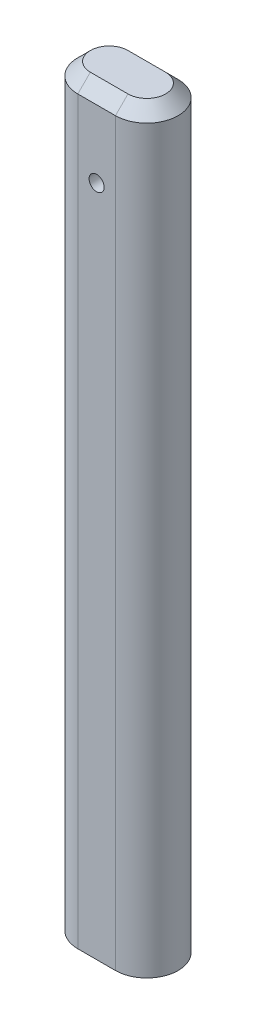
ISO-10303-21;
HEADER;
FILE_DESCRIPTION(('STEP AP214'),'2;1');
FILE_NAME('part.step','',(''),(''),'','','');
FILE_SCHEMA(('AUTOMOTIVE_DESIGN { 1 0 10303 214 1 1 1 1 }'));
ENDSEC;
DATA;
#1=APPLICATION_CONTEXT('core data for automotive mechanical design processes');
#2=APPLICATION_PROTOCOL_DEFINITION('international standard','automotive_design',2000,#1);
#3=PRODUCT_CONTEXT('',#1,'mechanical');
#4=PRODUCT('Part','Part','',(#3));
#5=PRODUCT_RELATED_PRODUCT_CATEGORY('part','',(#4));
#6=PRODUCT_DEFINITION_FORMATION('','',#4);
#7=PRODUCT_DEFINITION_CONTEXT('part definition',#1,'design');
#8=PRODUCT_DEFINITION('design','',#6,#7);
#9=PRODUCT_DEFINITION_SHAPE('','',#8);
#10=(LENGTH_UNIT() NAMED_UNIT(*) SI_UNIT(.MILLI.,.METRE.));
#11=(NAMED_UNIT(*) PLANE_ANGLE_UNIT() SI_UNIT($,.RADIAN.));
#12=(NAMED_UNIT(*) SI_UNIT($,.STERADIAN.) SOLID_ANGLE_UNIT());
#13=UNCERTAINTY_MEASURE_WITH_UNIT(LENGTH_MEASURE(1.E-05),#10,'distance_accuracy_value','');
#14=(GEOMETRIC_REPRESENTATION_CONTEXT(3) GLOBAL_UNCERTAINTY_ASSIGNED_CONTEXT((#13)) GLOBAL_UNIT_ASSIGNED_CONTEXT((#10,
#11,#12)) REPRESENTATION_CONTEXT('',''));
#15=CARTESIAN_POINT('',(0.,0.,0.));
#16=DIRECTION('',(0.,0.,1.));
#17=DIRECTION('',(1.,0.,0.));
#18=AXIS2_PLACEMENT_3D('',#15,#16,#17);
#19=CARTESIAN_POINT('',(12.4999999999999,300.,-12.5));
#20=DIRECTION('',(0.,-0.999999999999999,0.));
#21=DIRECTION('',(0.,0.,-0.999999999999999));
#22=AXIS2_PLACEMENT_3D('',#19,#20,#21);
#23=CYLINDRICAL_SURFACE('',#22,12.5);
#24=DIRECTION('',(0.,-0.999999999999999,0.));
#25=VECTOR('',#24,1.);
#26=CARTESIAN_POINT('',(12.5,300.,0.));
#27=LINE('',#26,#25);
#28=CARTESIAN_POINT('',(12.5,295.,0.));
#29=VERTEX_POINT('',#28);
#30=CARTESIAN_POINT('',(12.5,5.55111512312578E-13,0.));
#31=VERTEX_POINT('',#30);
#32=EDGE_CURVE('E111',#29,#31,#27,.T.);
#33=ORIENTED_EDGE('',*,*,#32,.F.);
#34=CARTESIAN_POINT('',(12.5,295.,-12.5));
#35=DIRECTION('',(0.,-0.999999999999999,0.));
#36=DIRECTION('',(0.,0.,-0.999999999999999));
#37=AXIS2_PLACEMENT_3D('',#34,#35,#36);
#38=CIRCLE('',#37,12.5);
#39=CARTESIAN_POINT('',(12.5,295.,-25.));
#40=VERTEX_POINT('',#39);
#41=EDGE_CURVE('E59',#29,#40,#38,.T.);
#42=ORIENTED_EDGE('',*,*,#41,.T.);
#43=DIRECTION('',(0.,-0.999999999999999,0.));
#44=VECTOR('',#43,1.);
#45=CARTESIAN_POINT('',(12.5,300.,-25.));
#46=LINE('',#45,#44);
#47=CARTESIAN_POINT('',(12.5,0.,-25.));
#48=VERTEX_POINT('',#47);
#49=EDGE_CURVE('E132',#48,#40,#46,.F.);
#50=ORIENTED_EDGE('',*,*,#49,.F.);
#51=CARTESIAN_POINT('',(12.4999999999999,2.22044604925031E-13,-12.4999999999999));
#52=DIRECTION('',(0.,-0.999999999999999,0.));
#53=DIRECTION('',(0.,0.,-0.999999999999999));
#54=AXIS2_PLACEMENT_3D('',#51,#52,#53);
#55=CIRCLE('',#54,12.5);
#56=EDGE_CURVE('E134',#31,#48,#55,.T.);
#57=ORIENTED_EDGE('',*,*,#56,.F.);
#58=EDGE_LOOP('',(#33,#42,#50,#57));
#59=FACE_BOUND('',#58,.T.);
#60=ADVANCED_FACE('F49',(#59),#23,.T.);
#61=CARTESIAN_POINT('',(27.5000000000001,2.22044604925031E-13,-12.4999999999999));
#62=DIRECTION('',(0.,-0.999999999999999,0.));
#63=DIRECTION('',(0.,0.,-0.999999999999999));
#64=AXIS2_PLACEMENT_3D('',#61,#62,#63);
#65=CYLINDRICAL_SURFACE('',#64,12.5);
#66=DIRECTION('',(0.,-0.999999999999999,0.));
#67=VECTOR('',#66,1.);
#68=CARTESIAN_POINT('',(27.5,300.,-25.));
#69=LINE('',#68,#67);
#70=CARTESIAN_POINT('',(27.5,295.,-25.));
#71=VERTEX_POINT('',#70);
#72=CARTESIAN_POINT('',(27.5,1.11022302462516E-13,-25.));
#73=VERTEX_POINT('',#72);
#74=EDGE_CURVE('E122',#71,#73,#69,.T.);
#75=ORIENTED_EDGE('',*,*,#74,.F.);
#76=CARTESIAN_POINT('',(27.5,295.,-12.5));
#77=DIRECTION('',(0.,-0.999999999999999,0.));
#78=DIRECTION('',(0.,0.,-0.999999999999999));
#79=AXIS2_PLACEMENT_3D('',#76,#77,#78);
#80=CIRCLE('',#79,12.5);
#81=CARTESIAN_POINT('',(27.4999999999999,295.,0.));
#82=VERTEX_POINT('',#81);
#83=EDGE_CURVE('E126',#71,#82,#80,.T.);
#84=ORIENTED_EDGE('',*,*,#83,.T.);
#85=DIRECTION('',(0.,-0.999999999999999,0.));
#86=VECTOR('',#85,1.);
#87=CARTESIAN_POINT('',(27.4999999999998,300.,0.));
#88=LINE('',#87,#86);
#89=CARTESIAN_POINT('',(27.4999999999999,2.22044604925031E-13,0.));
#90=VERTEX_POINT('',#89);
#91=EDGE_CURVE('E109',#90,#82,#88,.F.);
#92=ORIENTED_EDGE('',*,*,#91,.F.);
#93=CARTESIAN_POINT('',(27.5000000000001,2.22044604925031E-13,-12.4999999999999));
#94=DIRECTION('',(0.,-0.999999999999999,0.));
#95=DIRECTION('',(0.,0.,-0.999999999999999));
#96=AXIS2_PLACEMENT_3D('',#93,#94,#95);
#97=CIRCLE('',#96,12.5);
#98=EDGE_CURVE('E118',#73,#90,#97,.T.);
#99=ORIENTED_EDGE('',*,*,#98,.F.);
#100=EDGE_LOOP('',(#75,#84,#92,#99));
#101=FACE_BOUND('',#100,.T.);
#102=ADVANCED_FACE('F124',(#101),#65,.T.);
#103=CARTESIAN_POINT('',(0.,300.,0.));
#104=DIRECTION('',(0.,0.,-0.999999999999999));
#105=DIRECTION('',(-1.,0.,0.));
#106=AXIS2_PLACEMENT_3D('',#103,#104,#105);
#107=PLANE('',#106);
#108=CARTESIAN_POINT('',(20.,268.,0.));
#109=DIRECTION('',(0.,0.,0.999999999999999));
#110=DIRECTION('',(1.,0.,0.));
#111=AXIS2_PLACEMENT_3D('',#108,#109,#110);
#112=CIRCLE('',#111,2.99999999999999);
#113=CARTESIAN_POINT('',(23.,268.,0.));
#114=VERTEX_POINT('',#113);
#115=EDGE_CURVE('E228',#114,#114,#112,.T.);
#116=ORIENTED_EDGE('',*,*,#115,.F.);
#117=EDGE_LOOP('',(#116));
#118=FACE_BOUND('',#117,.T.);
#119=ORIENTED_EDGE('',*,*,#91,.T.);
#120=DIRECTION('',(-1.,0.,0.));
#121=VECTOR('',#120,1.);
#122=CARTESIAN_POINT('',(0.,295.,0.));
#123=LINE('',#122,#121);
#124=EDGE_CURVE('E145',#82,#29,#123,.T.);
#125=ORIENTED_EDGE('',*,*,#124,.T.);
#126=ORIENTED_EDGE('',*,*,#32,.T.);
#127=DIRECTION('',(1.,0.,0.));
#128=VECTOR('',#127,1.);
#129=CARTESIAN_POINT('',(0.,0.,0.));
#130=LINE('',#129,#128);
#131=EDGE_CURVE('E104',#31,#90,#130,.T.);
#132=ORIENTED_EDGE('',*,*,#131,.T.);
#133=EDGE_LOOP('',(#119,#125,#126,#132));
#134=FACE_BOUND('',#133,.T.);
#135=ADVANCED_FACE('F106',(#118,#134),#107,.F.);
#136=CARTESIAN_POINT('',(0.,300.,-25.));
#137=DIRECTION('',(0.,0.,0.999999999999999));
#138=DIRECTION('',(1.,0.,0.));
#139=AXIS2_PLACEMENT_3D('',#136,#137,#138);
#140=PLANE('',#139);
#141=CARTESIAN_POINT('',(20.,268.,-25.));
#142=DIRECTION('',(0.,0.,0.999999999999999));
#143=DIRECTION('',(1.,0.,0.));
#144=AXIS2_PLACEMENT_3D('',#141,#142,#143);
#145=CIRCLE('',#144,2.99999999999999);
#146=CARTESIAN_POINT('',(23.,268.,-25.));
#147=VERTEX_POINT('',#146);
#148=EDGE_CURVE('E152',#147,#147,#145,.T.);
#149=ORIENTED_EDGE('',*,*,#148,.T.);
#150=EDGE_LOOP('',(#149));
#151=FACE_BOUND('',#150,.T.);
#152=ORIENTED_EDGE('',*,*,#49,.T.);
#153=DIRECTION('',(1.,0.,0.));
#154=VECTOR('',#153,1.);
#155=CARTESIAN_POINT('',(0.,295.,-25.));
#156=LINE('',#155,#154);
#157=EDGE_CURVE('E13',#40,#71,#156,.T.);
#158=ORIENTED_EDGE('',*,*,#157,.T.);
#159=ORIENTED_EDGE('',*,*,#74,.T.);
#160=DIRECTION('',(-1.,0.,0.));
#161=VECTOR('',#160,1.);
#162=CARTESIAN_POINT('',(0.,1.11022302462516E-13,-24.9999999999999));
#163=LINE('',#162,#161);
#164=EDGE_CURVE('E114',#73,#48,#163,.T.);
#165=ORIENTED_EDGE('',*,*,#164,.T.);
#166=EDGE_LOOP('',(#152,#158,#159,#165));
#167=FACE_BOUND('',#166,.T.);
#168=ADVANCED_FACE('F171',(#151,#167),#140,.F.);
#169=CARTESIAN_POINT('',(0.,300.,0.));
#170=DIRECTION('',(0.,-0.999999999999999,0.));
#171=DIRECTION('',(0.,0.,-0.999999999999999));
#172=AXIS2_PLACEMENT_3D('',#169,#170,#171);
#173=PLANE('',#172);
#174=CARTESIAN_POINT('',(12.4999999999999,300.,-12.5));
#175=DIRECTION('',(0.,-0.999999999999999,0.));
#176=DIRECTION('',(0.,0.,-0.999999999999999));
#177=AXIS2_PLACEMENT_3D('',#174,#175,#176);
#178=CIRCLE('',#177,7.50000000000003);
#179=CARTESIAN_POINT('',(12.5,300.,-20.));
#180=VERTEX_POINT('',#179);
#181=CARTESIAN_POINT('',(12.4999999999999,300.,-4.99999999999998));
#182=VERTEX_POINT('',#181);
#183=EDGE_CURVE('E138',#180,#182,#178,.F.);
#184=ORIENTED_EDGE('',*,*,#183,.T.);
#185=DIRECTION('',(1.,0.,0.));
#186=VECTOR('',#185,1.);
#187=CARTESIAN_POINT('',(0.,300.,-4.99999999999998));
#188=LINE('',#187,#186);
#189=CARTESIAN_POINT('',(27.4999999999999,300.,-4.99999999999997));
#190=VERTEX_POINT('',#189);
#191=EDGE_CURVE('E142',#182,#190,#188,.T.);
#192=ORIENTED_EDGE('',*,*,#191,.T.);
#193=CARTESIAN_POINT('',(27.5,300.,-12.5));
#194=DIRECTION('',(0.,-0.999999999999999,0.));
#195=DIRECTION('',(0.,0.,-0.999999999999999));
#196=AXIS2_PLACEMENT_3D('',#193,#194,#195);
#197=CIRCLE('',#196,7.50000000000002);
#198=CARTESIAN_POINT('',(27.5000000000001,300.,-20.));
#199=VERTEX_POINT('',#198);
#200=EDGE_CURVE('E140',#190,#199,#197,.F.);
#201=ORIENTED_EDGE('',*,*,#200,.T.);
#202=DIRECTION('',(-1.,0.,0.));
#203=VECTOR('',#202,1.);
#204=CARTESIAN_POINT('',(0.,300.,-20.));
#205=LINE('',#204,#203);
#206=EDGE_CURVE('E136',#199,#180,#205,.T.);
#207=ORIENTED_EDGE('',*,*,#206,.T.);
#208=EDGE_LOOP('',(#184,#192,#201,#207));
#209=FACE_BOUND('',#208,.T.);
#210=ADVANCED_FACE('F173',(#209),#173,.F.);
#211=CARTESIAN_POINT('',(0.,0.,0.));
#212=DIRECTION('',(0.,-0.999999999999999,0.));
#213=DIRECTION('',(0.,0.,-0.999999999999999));
#214=AXIS2_PLACEMENT_3D('',#211,#212,#213);
#215=PLANE('',#214);
#216=ORIENTED_EDGE('',*,*,#131,.F.);
#217=ORIENTED_EDGE('',*,*,#56,.T.);
#218=ORIENTED_EDGE('',*,*,#164,.F.);
#219=ORIENTED_EDGE('',*,*,#98,.T.);
#220=EDGE_LOOP('',(#216,#217,#218,#219));
#221=FACE_BOUND('',#220,.T.);
#222=ADVANCED_FACE('F119',(#221),#215,.T.);
#223=CARTESIAN_POINT('',(0.,300.,-20.));
#224=DIRECTION('',(0.,-0.707106781186545,0.707106781186549));
#225=DIRECTION('',(-1.,0.,0.));
#226=AXIS2_PLACEMENT_3D('',#223,#224,#225);
#227=PLANE('',#226);
#228=DIRECTION('',(0.,0.707106781186549,0.707106781186545));
#229=VECTOR('',#228,1.);
#230=CARTESIAN_POINT('',(27.5,295.,-25.));
#231=LINE('',#230,#229);
#232=EDGE_CURVE('E153',#71,#199,#231,.T.);
#233=ORIENTED_EDGE('',*,*,#232,.F.);
#234=ORIENTED_EDGE('',*,*,#157,.F.);
#235=DIRECTION('',(0.,-0.707106781186549,-0.707106781186545));
#236=VECTOR('',#235,1.);
#237=CARTESIAN_POINT('',(12.5,300.,-20.));
#238=LINE('',#237,#236);
#239=EDGE_CURVE('E54',#180,#40,#238,.T.);
#240=ORIENTED_EDGE('',*,*,#239,.F.);
#241=ORIENTED_EDGE('',*,*,#206,.F.);
#242=EDGE_LOOP('',(#233,#234,#240,#241));
#243=FACE_BOUND('',#242,.T.);
#244=ADVANCED_FACE('F52',(#243),#227,.F.);
#245=CARTESIAN_POINT('',(12.4999999999999,300.,-12.5));
#246=DIRECTION('',(0.,-0.999999999999999,0.));
#247=DIRECTION('',(0.,0.,-0.999999999999999));
#248=AXIS2_PLACEMENT_3D('',#245,#246,#247);
#249=CONICAL_SURFACE('',#248,7.50000000000003,0.785398163397446);
#250=ORIENTED_EDGE('',*,*,#239,.T.);
#251=ORIENTED_EDGE('',*,*,#41,.F.);
#252=DIRECTION('',(0.,-0.707106781186549,0.707106781186545));
#253=VECTOR('',#252,1.);
#254=CARTESIAN_POINT('',(12.4999999999999,300.,-4.99999999999998));
#255=LINE('',#254,#253);
#256=EDGE_CURVE('E151',#182,#29,#255,.T.);
#257=ORIENTED_EDGE('',*,*,#256,.F.);
#258=ORIENTED_EDGE('',*,*,#183,.F.);
#259=EDGE_LOOP('',(#250,#251,#257,#258));
#260=FACE_BOUND('',#259,.T.);
#261=ADVANCED_FACE('F162',(#260),#249,.T.);
#262=CARTESIAN_POINT('',(27.5,300.,-12.5));
#263=DIRECTION('',(0.,-0.999999999999999,0.));
#264=DIRECTION('',(0.,0.,-0.999999999999999));
#265=AXIS2_PLACEMENT_3D('',#262,#263,#264);
#266=CONICAL_SURFACE('',#265,7.50000000000002,0.785398163397446);
#267=ORIENTED_EDGE('',*,*,#232,.T.);
#268=ORIENTED_EDGE('',*,*,#200,.F.);
#269=DIRECTION('',(0.,0.707106781186549,-0.707106781186545));
#270=VECTOR('',#269,1.);
#271=CARTESIAN_POINT('',(27.4999999999999,295.,0.));
#272=LINE('',#271,#270);
#273=EDGE_CURVE('E149',#82,#190,#272,.T.);
#274=ORIENTED_EDGE('',*,*,#273,.F.);
#275=ORIENTED_EDGE('',*,*,#83,.F.);
#276=EDGE_LOOP('',(#267,#268,#274,#275));
#277=FACE_BOUND('',#276,.T.);
#278=ADVANCED_FACE('F167',(#277),#266,.T.);
#279=CARTESIAN_POINT('',(0.,300.,-4.99999999999998));
#280=DIRECTION('',(0.,-0.707106781186545,-0.707106781186548));
#281=DIRECTION('',(1.,0.,0.));
#282=AXIS2_PLACEMENT_3D('',#279,#280,#281);
#283=PLANE('',#282);
#284=ORIENTED_EDGE('',*,*,#256,.T.);
#285=ORIENTED_EDGE('',*,*,#124,.F.);
#286=ORIENTED_EDGE('',*,*,#273,.T.);
#287=ORIENTED_EDGE('',*,*,#191,.F.);
#288=EDGE_LOOP('',(#284,#285,#286,#287));
#289=FACE_BOUND('',#288,.T.);
#290=ADVANCED_FACE('F170',(#289),#283,.F.);
#291=CARTESIAN_POINT('',(20.,268.,-25.));
#292=DIRECTION('',(0.,0.,0.999999999999999));
#293=DIRECTION('',(1.,0.,0.));
#294=AXIS2_PLACEMENT_3D('',#291,#292,#293);
#295=CYLINDRICAL_SURFACE('',#294,2.99999999999999);
#296=CARTESIAN_POINT('',(23.,268.,-25.));
#297=CARTESIAN_POINT('',(23.,268.,-24.7395833333333));
#298=CARTESIAN_POINT('',(23.,268.,-24.4791666666667));
#299=CARTESIAN_POINT('',(23.,268.,-23.9583333333333));
#300=CARTESIAN_POINT('',(23.,268.,-23.6979166666667));
#301=CARTESIAN_POINT('',(23.,268.,-23.1770833333333));
#302=CARTESIAN_POINT('',(23.,268.,-22.9166666666667));
#303=CARTESIAN_POINT('',(23.,268.,-22.3958333333333));
#304=CARTESIAN_POINT('',(23.,268.,-22.1354166666667));
#305=CARTESIAN_POINT('',(23.,268.,-21.6145833333333));
#306=CARTESIAN_POINT('',(23.,268.,-21.3541666666667));
#307=CARTESIAN_POINT('',(23.,268.,-20.8333333333333));
#308=CARTESIAN_POINT('',(23.,268.,-20.5729166666667));
#309=CARTESIAN_POINT('',(23.,268.,-20.0520833333333));
#310=CARTESIAN_POINT('',(23.,268.,-19.7916666666667));
#311=CARTESIAN_POINT('',(23.,268.,-19.2708333333333));
#312=CARTESIAN_POINT('',(23.,268.,-19.0104166666667));
#313=CARTESIAN_POINT('',(23.,268.,-18.4895833333333));
#314=CARTESIAN_POINT('',(23.,268.,-18.2291666666667));
#315=CARTESIAN_POINT('',(23.,268.,-17.7083333333333));
#316=CARTESIAN_POINT('',(23.,268.,-17.4479166666667));
#317=CARTESIAN_POINT('',(23.,268.,-16.9270833333333));
#318=CARTESIAN_POINT('',(23.,268.,-16.6666666666667));
#319=CARTESIAN_POINT('',(23.,268.,-16.1458333333333));
#320=CARTESIAN_POINT('',(23.,268.,-15.8854166666667));
#321=CARTESIAN_POINT('',(23.,268.,-15.3645833333333));
#322=CARTESIAN_POINT('',(23.,268.,-15.1041666666667));
#323=CARTESIAN_POINT('',(23.,268.,-14.5833333333333));
#324=CARTESIAN_POINT('',(23.,268.,-14.3229166666667));
#325=CARTESIAN_POINT('',(23.,268.,-13.8020833333333));
#326=CARTESIAN_POINT('',(23.,268.,-13.5416666666667));
#327=CARTESIAN_POINT('',(23.,268.,-13.0208333333333));
#328=CARTESIAN_POINT('',(23.,268.,-12.7604166666667));
#329=CARTESIAN_POINT('',(23.,268.,-12.2395833333333));
#330=CARTESIAN_POINT('',(23.,268.,-11.9791666666667));
#331=CARTESIAN_POINT('',(23.,268.,-11.4583333333333));
#332=CARTESIAN_POINT('',(23.,268.,-11.1979166666667));
#333=CARTESIAN_POINT('',(23.,268.,-10.6770833333333));
#334=CARTESIAN_POINT('',(23.,268.,-10.4166666666667));
#335=CARTESIAN_POINT('',(23.,268.,-9.89583333333333));
#336=CARTESIAN_POINT('',(23.,268.,-9.63541666666667));
#337=CARTESIAN_POINT('',(23.,268.,-9.11458333333333));
#338=CARTESIAN_POINT('',(23.,268.,-8.85416666666666));
#339=CARTESIAN_POINT('',(23.,268.,-8.33333333333333));
#340=CARTESIAN_POINT('',(23.,268.,-8.07291666666667));
#341=CARTESIAN_POINT('',(23.,268.,-7.55208333333333));
#342=CARTESIAN_POINT('',(23.,268.,-7.29166666666667));
#343=CARTESIAN_POINT('',(23.,268.,-6.77083333333333));
#344=CARTESIAN_POINT('',(23.,268.,-6.51041666666667));
#345=CARTESIAN_POINT('',(23.,268.,-5.98958333333333));
#346=CARTESIAN_POINT('',(23.,268.,-5.72916666666666));
#347=CARTESIAN_POINT('',(23.,268.,-5.20833333333333));
#348=CARTESIAN_POINT('',(23.,268.,-4.94791666666666));
#349=CARTESIAN_POINT('',(23.,268.,-4.42708333333333));
#350=CARTESIAN_POINT('',(23.,268.,-4.16666666666667));
#351=CARTESIAN_POINT('',(23.,268.,-3.64583333333333));
#352=CARTESIAN_POINT('',(23.,268.,-3.38541666666667));
#353=CARTESIAN_POINT('',(23.,268.,-2.86458333333333));
#354=CARTESIAN_POINT('',(23.,268.,-2.60416666666667));
#355=CARTESIAN_POINT('',(23.,268.,-2.08333333333334));
#356=CARTESIAN_POINT('',(23.,268.,-1.82291666666667));
#357=CARTESIAN_POINT('',(23.,268.,-1.30208333333334));
#358=CARTESIAN_POINT('',(23.,268.,-1.04166666666667));
#359=CARTESIAN_POINT('',(23.,268.,-0.520833333333337));
#360=CARTESIAN_POINT('',(23.,268.,-0.26041666666667));
#361=CARTESIAN_POINT('',(23.,268.,0.));
#362=B_SPLINE_CURVE_WITH_KNOTS('',3,(#296,#297,#298,#299,#300,#301,#302,#303,#304,#305,#306,
#307,#308,#309,#310,#311,#312,#313,#314,#315,#316,#317,#318,#319,#320,#321,#322,#323,#324,#325,
#326,#327,#328,#329,#330,#331,#332,#333,#334,#335,#336,#337,#338,#339,#340,#341,#342,#343,#344,
#345,#346,#347,#348,#349,#350,#351,#352,#353,#354,#355,#356,#357,#358,#359,#360,#361),
.UNSPECIFIED.,.F.,.F.,(4,2,2,2,2,2,2,2,2,2,2,2,2,2,2,2,2,2,2,2,2,2,2,2,2,2,2,2,2,2,2,2,4),(0.,
0.781249999999997,1.5625,2.34375,3.125,3.90625,4.68749999999999,5.46874999999999,6.25,
7.03124999999999,7.81249999999999,8.59374999999999,9.37499999999999,10.15625,10.9375,11.71875,
12.5,13.28125,14.0625,14.84375,15.625,16.40625,17.1875,17.96875,18.75,19.53125,20.3125,21.09375,
21.875,22.65625,23.4375,24.21875,25.),.UNSPECIFIED.);
#363=EDGE_CURVE('BSEAM203',#147,#114,#362,.T.);
#364=ORIENTED_EDGE('',*,*,#148,.F.);
#365=ORIENTED_EDGE('',*,*,#115,.T.);
#366=ORIENTED_EDGE('',*,*,#363,.T.);
#367=ORIENTED_EDGE('',*,*,#363,.F.);
#368=EDGE_LOOP('',(#364,#366,#365,#367));
#369=FACE_BOUND('',#368,.T.);
#370=ADVANCED_FACE('F203',(#369),#295,.F.);
#371=CLOSED_SHELL('',(#60,#102,#135,#168,#210,#222,#244,#261,#278,#290,#370));
#372=MANIFOLD_SOLID_BREP('B2',#371);
#373=ADVANCED_BREP_SHAPE_REPRESENTATION('',(#18,#372),#14);
#374=SHAPE_DEFINITION_REPRESENTATION(#9,#373);
ENDSEC;
END-ISO-10303-21;
